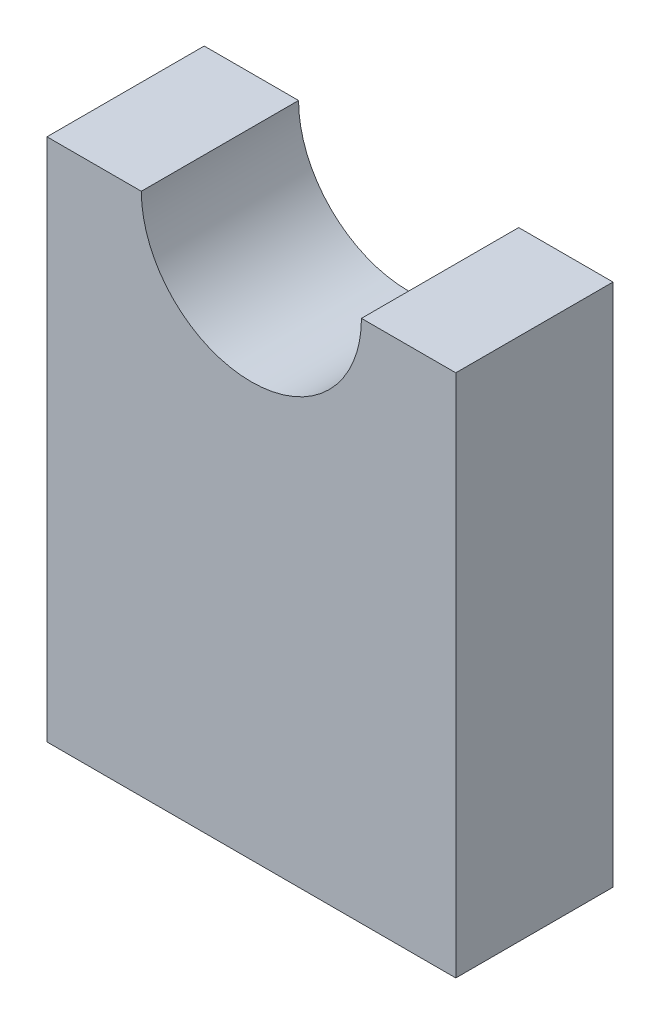
ISO-10303-21;
HEADER;
FILE_DESCRIPTION(('STEP AP214'),'2;1');
FILE_NAME('part.step','',(''),(''),'','','');
FILE_SCHEMA(('AUTOMOTIVE_DESIGN { 1 0 10303 214 1 1 1 1 }'));
ENDSEC;
DATA;
#1=APPLICATION_CONTEXT('core data for automotive mechanical design processes');
#2=APPLICATION_PROTOCOL_DEFINITION('international standard','automotive_design',2000,#1);
#3=PRODUCT_CONTEXT('',#1,'mechanical');
#4=PRODUCT('Part','Part','',(#3));
#5=PRODUCT_RELATED_PRODUCT_CATEGORY('part','',(#4));
#6=PRODUCT_DEFINITION_FORMATION('','',#4);
#7=PRODUCT_DEFINITION_CONTEXT('part definition',#1,'design');
#8=PRODUCT_DEFINITION('design','',#6,#7);
#9=PRODUCT_DEFINITION_SHAPE('','',#8);
#10=(LENGTH_UNIT() NAMED_UNIT(*) SI_UNIT(.MILLI.,.METRE.));
#11=(NAMED_UNIT(*) PLANE_ANGLE_UNIT() SI_UNIT($,.RADIAN.));
#12=(NAMED_UNIT(*) SI_UNIT($,.STERADIAN.) SOLID_ANGLE_UNIT());
#13=UNCERTAINTY_MEASURE_WITH_UNIT(LENGTH_MEASURE(1.E-05),#10,'distance_accuracy_value','');
#14=(GEOMETRIC_REPRESENTATION_CONTEXT(3) GLOBAL_UNCERTAINTY_ASSIGNED_CONTEXT((#13)) GLOBAL_UNIT_ASSIGNED_CONTEXT((#10,
#11,#12)) REPRESENTATION_CONTEXT('',''));
#15=CARTESIAN_POINT('',(0.,0.,0.));
#16=DIRECTION('',(0.,0.,1.));
#17=DIRECTION('',(1.,0.,0.));
#18=AXIS2_PLACEMENT_3D('',#15,#16,#17);
#19=CARTESIAN_POINT('',(0.,0.,30.));
#20=DIRECTION('',(1.,0.,0.));
#21=DIRECTION('',(0.,0.,-1.));
#22=AXIS2_PLACEMENT_3D('',#19,#20,#21);
#23=PLANE('',#22);
#24=DIRECTION('',(0.,-1.,0.));
#25=VECTOR('',#24,1.);
#26=CARTESIAN_POINT('',(0.,0.,0.));
#27=LINE('',#26,#25);
#28=CARTESIAN_POINT('',(0.,100.,0.));
#29=VERTEX_POINT('',#28);
#30=CARTESIAN_POINT('',(0.,0.,0.));
#31=VERTEX_POINT('',#30);
#32=EDGE_CURVE('E98',#29,#31,#27,.T.);
#33=ORIENTED_EDGE('',*,*,#32,.T.);
#34=DIRECTION('',(0.,0.,-1.));
#35=VECTOR('',#34,1.);
#36=CARTESIAN_POINT('',(0.,0.,30.));
#37=LINE('',#36,#35);
#38=CARTESIAN_POINT('',(0.,0.,30.));
#39=VERTEX_POINT('',#38);
#40=EDGE_CURVE('E11',#39,#31,#37,.T.);
#41=ORIENTED_EDGE('',*,*,#40,.F.);
#42=DIRECTION('',(0.,-1.,0.));
#43=VECTOR('',#42,1.);
#44=CARTESIAN_POINT('',(0.,0.,30.));
#45=LINE('',#44,#43);
#46=CARTESIAN_POINT('',(0.,100.,30.));
#47=VERTEX_POINT('',#46);
#48=EDGE_CURVE('E128',#47,#39,#45,.T.);
#49=ORIENTED_EDGE('',*,*,#48,.F.);
#50=DIRECTION('',(0.,0.,-1.));
#51=VECTOR('',#50,1.);
#52=CARTESIAN_POINT('',(0.,100.,30.));
#53=LINE('',#52,#51);
#54=EDGE_CURVE('E112',#47,#29,#53,.T.);
#55=ORIENTED_EDGE('',*,*,#54,.T.);
#56=EDGE_LOOP('',(#33,#41,#49,#55));
#57=FACE_BOUND('',#56,.T.);
#58=ADVANCED_FACE('F41',(#57),#23,.F.);
#59=CARTESIAN_POINT('',(0.,0.,30.));
#60=DIRECTION('',(0.,1.,0.));
#61=DIRECTION('',(0.,0.,1.));
#62=AXIS2_PLACEMENT_3D('',#59,#60,#61);
#63=PLANE('',#62);
#64=DIRECTION('',(1.,0.,0.));
#65=VECTOR('',#64,1.);
#66=CARTESIAN_POINT('',(0.,0.,0.));
#67=LINE('',#66,#65);
#68=CARTESIAN_POINT('',(78.,0.,0.));
#69=VERTEX_POINT('',#68);
#70=EDGE_CURVE('E94',#31,#69,#67,.T.);
#71=ORIENTED_EDGE('',*,*,#70,.T.);
#72=DIRECTION('',(0.,0.,-1.));
#73=VECTOR('',#72,1.);
#74=CARTESIAN_POINT('',(78.,0.,30.));
#75=LINE('',#74,#73);
#76=CARTESIAN_POINT('',(78.,0.,30.));
#77=VERTEX_POINT('',#76);
#78=EDGE_CURVE('E49',#77,#69,#75,.T.);
#79=ORIENTED_EDGE('',*,*,#78,.F.);
#80=DIRECTION('',(1.,0.,0.));
#81=VECTOR('',#80,1.);
#82=CARTESIAN_POINT('',(0.,0.,30.));
#83=LINE('',#82,#81);
#84=EDGE_CURVE('E108',#39,#77,#83,.T.);
#85=ORIENTED_EDGE('',*,*,#84,.F.);
#86=ORIENTED_EDGE('',*,*,#40,.T.);
#87=EDGE_LOOP('',(#71,#79,#85,#86));
#88=FACE_BOUND('',#87,.T.);
#89=ADVANCED_FACE('F107',(#88),#63,.F.);
#90=CARTESIAN_POINT('',(78.,0.,30.));
#91=DIRECTION('',(-1.,0.,0.));
#92=DIRECTION('',(0.,0.,1.));
#93=AXIS2_PLACEMENT_3D('',#90,#91,#92);
#94=PLANE('',#93);
#95=DIRECTION('',(0.,1.,0.));
#96=VECTOR('',#95,1.);
#97=CARTESIAN_POINT('',(78.,0.,0.));
#98=LINE('',#97,#96);
#99=CARTESIAN_POINT('',(78.,100.,0.));
#100=VERTEX_POINT('',#99);
#101=EDGE_CURVE('E100',#69,#100,#98,.T.);
#102=ORIENTED_EDGE('',*,*,#101,.T.);
#103=DIRECTION('',(0.,0.,-1.));
#104=VECTOR('',#103,1.);
#105=CARTESIAN_POINT('',(78.,100.,30.));
#106=LINE('',#105,#104);
#107=CARTESIAN_POINT('',(78.,100.,30.));
#108=VERTEX_POINT('',#107);
#109=EDGE_CURVE('E153',#108,#100,#106,.T.);
#110=ORIENTED_EDGE('',*,*,#109,.F.);
#111=DIRECTION('',(0.,1.,0.));
#112=VECTOR('',#111,1.);
#113=CARTESIAN_POINT('',(78.,0.,30.));
#114=LINE('',#113,#112);
#115=EDGE_CURVE('E133',#77,#108,#114,.T.);
#116=ORIENTED_EDGE('',*,*,#115,.F.);
#117=ORIENTED_EDGE('',*,*,#78,.T.);
#118=EDGE_LOOP('',(#102,#110,#116,#117));
#119=FACE_BOUND('',#118,.T.);
#120=ADVANCED_FACE('F160',(#119),#94,.F.);
#121=CARTESIAN_POINT('',(60.,100.,30.));
#122=DIRECTION('',(0.,-1.,0.));
#123=DIRECTION('',(0.,0.,-1.));
#124=AXIS2_PLACEMENT_3D('',#121,#122,#123);
#125=PLANE('',#124);
#126=DIRECTION('',(-1.,0.,0.));
#127=VECTOR('',#126,1.);
#128=CARTESIAN_POINT('',(60.,100.,0.));
#129=LINE('',#128,#127);
#130=CARTESIAN_POINT('',(60.,100.,0.));
#131=VERTEX_POINT('',#130);
#132=EDGE_CURVE('E119',#100,#131,#129,.T.);
#133=ORIENTED_EDGE('',*,*,#132,.T.);
#134=DIRECTION('',(0.,0.,-1.));
#135=VECTOR('',#134,1.);
#136=CARTESIAN_POINT('',(60.,100.,30.));
#137=LINE('',#136,#135);
#138=CARTESIAN_POINT('',(60.,100.,30.));
#139=VERTEX_POINT('',#138);
#140=EDGE_CURVE('E149',#139,#131,#137,.T.);
#141=ORIENTED_EDGE('',*,*,#140,.F.);
#142=DIRECTION('',(-1.,0.,0.));
#143=VECTOR('',#142,1.);
#144=CARTESIAN_POINT('',(60.,100.,30.));
#145=LINE('',#144,#143);
#146=EDGE_CURVE('E136',#108,#139,#145,.T.);
#147=ORIENTED_EDGE('',*,*,#146,.F.);
#148=ORIENTED_EDGE('',*,*,#109,.T.);
#149=EDGE_LOOP('',(#133,#141,#147,#148));
#150=FACE_BOUND('',#149,.T.);
#151=ADVANCED_FACE('F166',(#150),#125,.F.);
#152=CARTESIAN_POINT('',(39.,100.,30.));
#153=DIRECTION('',(0.,0.,-1.));
#154=DIRECTION('',(-1.,0.,0.));
#155=AXIS2_PLACEMENT_3D('',#152,#153,#154);
#156=CYLINDRICAL_SURFACE('',#155,21.);
#157=CARTESIAN_POINT('',(39.,100.,0.));
#158=DIRECTION('',(0.,0.,-1.));
#159=DIRECTION('',(1.,0.,0.));
#160=AXIS2_PLACEMENT_3D('',#157,#158,#159);
#161=CIRCLE('',#160,21.);
#162=CARTESIAN_POINT('',(18.,100.,0.));
#163=VERTEX_POINT('',#162);
#164=EDGE_CURVE('E122',#131,#163,#161,.T.);
#165=ORIENTED_EDGE('',*,*,#164,.T.);
#166=DIRECTION('',(0.,0.,-1.));
#167=VECTOR('',#166,1.);
#168=CARTESIAN_POINT('',(18.,100.,30.));
#169=LINE('',#168,#167);
#170=CARTESIAN_POINT('',(18.,100.,30.));
#171=VERTEX_POINT('',#170);
#172=EDGE_CURVE('E145',#171,#163,#169,.T.);
#173=ORIENTED_EDGE('',*,*,#172,.F.);
#174=CARTESIAN_POINT('',(39.,100.,30.));
#175=DIRECTION('',(0.,0.,-1.));
#176=DIRECTION('',(1.,0.,0.));
#177=AXIS2_PLACEMENT_3D('',#174,#175,#176);
#178=CIRCLE('',#177,21.);
#179=EDGE_CURVE('E61',#139,#171,#178,.T.);
#180=ORIENTED_EDGE('',*,*,#179,.F.);
#181=ORIENTED_EDGE('',*,*,#140,.T.);
#182=EDGE_LOOP('',(#165,#173,#180,#181));
#183=FACE_BOUND('',#182,.T.);
#184=ADVANCED_FACE('F169',(#183),#156,.F.);
#185=CARTESIAN_POINT('',(0.,100.,30.));
#186=DIRECTION('',(0.,-1.,0.));
#187=DIRECTION('',(0.,0.,-1.));
#188=AXIS2_PLACEMENT_3D('',#185,#186,#187);
#189=PLANE('',#188);
#190=DIRECTION('',(-1.,0.,0.));
#191=VECTOR('',#190,1.);
#192=CARTESIAN_POINT('',(0.,100.,0.));
#193=LINE('',#192,#191);
#194=EDGE_CURVE('E125',#163,#29,#193,.T.);
#195=ORIENTED_EDGE('',*,*,#194,.T.);
#196=ORIENTED_EDGE('',*,*,#54,.F.);
#197=DIRECTION('',(-1.,0.,0.));
#198=VECTOR('',#197,1.);
#199=CARTESIAN_POINT('',(0.,100.,30.));
#200=LINE('',#199,#198);
#201=EDGE_CURVE('E56',#171,#47,#200,.T.);
#202=ORIENTED_EDGE('',*,*,#201,.F.);
#203=ORIENTED_EDGE('',*,*,#172,.T.);
#204=EDGE_LOOP('',(#195,#196,#202,#203));
#205=FACE_BOUND('',#204,.T.);
#206=ADVANCED_FACE('F171',(#205),#189,.F.);
#207=CARTESIAN_POINT('',(39.,100.,30.));
#208=DIRECTION('',(0.,0.,1.));
#209=DIRECTION('',(1.,0.,0.));
#210=AXIS2_PLACEMENT_3D('',#207,#208,#209);
#211=PLANE('',#210);
#212=ORIENTED_EDGE('',*,*,#48,.T.);
#213=ORIENTED_EDGE('',*,*,#84,.T.);
#214=ORIENTED_EDGE('',*,*,#115,.T.);
#215=ORIENTED_EDGE('',*,*,#146,.T.);
#216=ORIENTED_EDGE('',*,*,#179,.T.);
#217=ORIENTED_EDGE('',*,*,#201,.T.);
#218=EDGE_LOOP('',(#212,#213,#214,#215,#216,#217));
#219=FACE_BOUND('',#218,.T.);
#220=ADVANCED_FACE('F163',(#219),#211,.T.);
#221=CARTESIAN_POINT('',(39.,100.,0.));
#222=DIRECTION('',(0.,0.,1.));
#223=DIRECTION('',(1.,0.,0.));
#224=AXIS2_PLACEMENT_3D('',#221,#222,#223);
#225=PLANE('',#224);
#226=ORIENTED_EDGE('',*,*,#32,.F.);
#227=ORIENTED_EDGE('',*,*,#194,.F.);
#228=ORIENTED_EDGE('',*,*,#164,.F.);
#229=ORIENTED_EDGE('',*,*,#132,.F.);
#230=ORIENTED_EDGE('',*,*,#101,.F.);
#231=ORIENTED_EDGE('',*,*,#70,.F.);
#232=EDGE_LOOP('',(#226,#227,#228,#229,#230,#231));
#233=FACE_BOUND('',#232,.T.);
#234=ADVANCED_FACE('F95',(#233),#225,.F.);
#235=CLOSED_SHELL('',(#58,#89,#120,#151,#184,#206,#220,#234));
#236=MANIFOLD_SOLID_BREP('B2',#235);
#237=ADVANCED_BREP_SHAPE_REPRESENTATION('',(#18,#236),#14);
#238=SHAPE_DEFINITION_REPRESENTATION(#9,#237);
ENDSEC;
END-ISO-10303-21;
